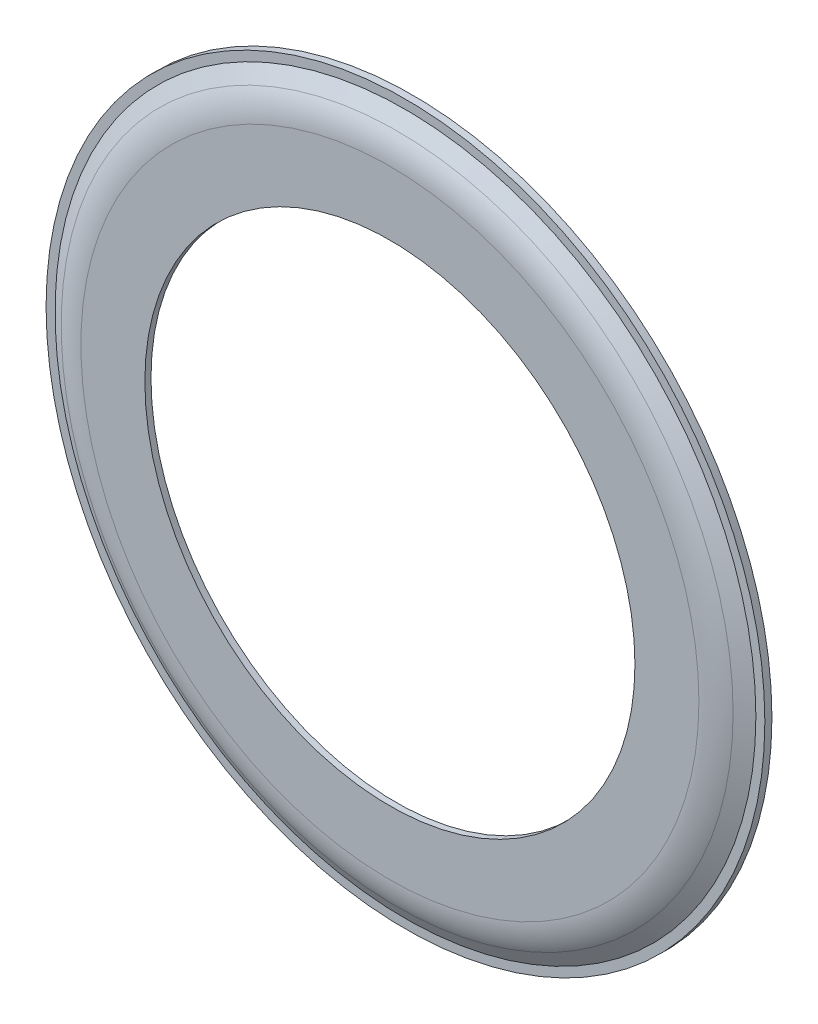
ISO-10303-21;
HEADER;
FILE_DESCRIPTION(('STEP AP214'),'2;1');
FILE_NAME('part.step','',(''),(''),'','','');
FILE_SCHEMA(('AUTOMOTIVE_DESIGN { 1 0 10303 214 1 1 1 1 }'));
ENDSEC;
DATA;
#1=APPLICATION_CONTEXT('core data for automotive mechanical design processes');
#2=APPLICATION_PROTOCOL_DEFINITION('international standard','automotive_design',2000,#1);
#3=PRODUCT_CONTEXT('',#1,'mechanical');
#4=PRODUCT('Part','Part','',(#3));
#5=PRODUCT_RELATED_PRODUCT_CATEGORY('part','',(#4));
#6=PRODUCT_DEFINITION_FORMATION('','',#4);
#7=PRODUCT_DEFINITION_CONTEXT('part definition',#1,'design');
#8=PRODUCT_DEFINITION('design','',#6,#7);
#9=PRODUCT_DEFINITION_SHAPE('','',#8);
#10=(LENGTH_UNIT() NAMED_UNIT(*) SI_UNIT(.MILLI.,.METRE.));
#11=(NAMED_UNIT(*) PLANE_ANGLE_UNIT() SI_UNIT($,.RADIAN.));
#12=(NAMED_UNIT(*) SI_UNIT($,.STERADIAN.) SOLID_ANGLE_UNIT());
#13=UNCERTAINTY_MEASURE_WITH_UNIT(LENGTH_MEASURE(1.E-05),#10,'distance_accuracy_value','');
#14=(GEOMETRIC_REPRESENTATION_CONTEXT(3) GLOBAL_UNCERTAINTY_ASSIGNED_CONTEXT((#13)) GLOBAL_UNIT_ASSIGNED_CONTEXT((#10,
#11,#12)) REPRESENTATION_CONTEXT('',''));
#15=CARTESIAN_POINT('',(0.,0.,0.));
#16=DIRECTION('',(0.,0.,1.));
#17=DIRECTION('',(1.,0.,0.));
#18=AXIS2_PLACEMENT_3D('',#15,#16,#17);
#19=CARTESIAN_POINT('',(0.,2.95,1.975));
#20=DIRECTION('',(0.,0.,-1.));
#21=DIRECTION('',(-1.,0.,0.));
#22=AXIS2_PLACEMENT_3D('',#19,#20,#21);
#23=PLANE('',#22);
#24=CARTESIAN_POINT('',(0.,0.,1.975));
#25=DIRECTION('',(0.,0.,1.));
#26=DIRECTION('',(1.,0.,0.));
#27=AXIS2_PLACEMENT_3D('',#24,#25,#26);
#28=CIRCLE('',#27,3.);
#29=CARTESIAN_POINT('',(3.,0.,1.975));
#30=VERTEX_POINT('',#29);
#31=EDGE_CURVE('E66',#30,#30,#28,.T.);
#32=ORIENTED_EDGE('',*,*,#31,.F.);
#33=EDGE_LOOP('',(#32));
#34=FACE_BOUND('',#33,.T.);
#35=CARTESIAN_POINT('',(0.,0.,1.975));
#36=DIRECTION('',(0.,0.,1.));
#37=DIRECTION('',(1.,0.,0.));
#38=AXIS2_PLACEMENT_3D('',#35,#36,#37);
#39=CIRCLE('',#38,3.78315353299546);
#40=CARTESIAN_POINT('',(3.78315353299546,0.,1.975));
#41=VERTEX_POINT('',#40);
#42=EDGE_CURVE('E10',#41,#41,#39,.T.);
#43=ORIENTED_EDGE('',*,*,#42,.T.);
#44=EDGE_LOOP('',(#43));
#45=FACE_BOUND('',#44,.T.);
#46=ADVANCED_FACE('F38',(#34,#45),#23,.F.);
#47=CARTESIAN_POINT('',(0.,0.,1.315));
#48=DIRECTION('',(0.,0.,1.));
#49=DIRECTION('',(1.,0.,0.));
#50=AXIS2_PLACEMENT_3D('',#47,#48,#49);
#51=TOROIDAL_SURFACE('',#50,3.78315353299546,0.66);
#52=ORIENTED_EDGE('',*,*,#42,.F.);
#53=EDGE_LOOP('',(#52));
#54=FACE_BOUND('',#53,.T.);
#55=CARTESIAN_POINT('',(0.,0.,1.88657676649773));
#56=DIRECTION('',(0.,0.,1.));
#57=DIRECTION('',(1.,0.,0.));
#58=AXIS2_PLACEMENT_3D('',#55,#56,#57);
#59=CIRCLE('',#58,4.11315353299546);
#60=CARTESIAN_POINT('',(4.11315353299546,0.,1.88657676649773));
#61=VERTEX_POINT('',#60);
#62=EDGE_CURVE('E45',#61,#61,#59,.T.);
#63=ORIENTED_EDGE('',*,*,#62,.T.);
#64=EDGE_LOOP('',(#63));
#65=FACE_BOUND('',#64,.T.);
#66=ADVANCED_FACE('F85',(#54,#65),#51,.T.);
#67=CARTESIAN_POINT('',(0.,0.,1.78447441116742));
#68=DIRECTION('',(0.,0.,-1.));
#69=DIRECTION('',(-1.,0.,0.));
#70=AXIS2_PLACEMENT_3D('',#67,#68,#69);
#71=CONICAL_SURFACE('',#70,4.29,1.04719755119659);
#72=ORIENTED_EDGE('',*,*,#62,.F.);
#73=EDGE_LOOP('',(#72));
#74=FACE_BOUND('',#73,.T.);
#75=CARTESIAN_POINT('',(0.,0.,1.78447441116742));
#76=DIRECTION('',(0.,0.,1.));
#77=DIRECTION('',(1.,0.,0.));
#78=AXIS2_PLACEMENT_3D('',#75,#76,#77);
#79=CIRCLE('',#78,4.29);
#80=CARTESIAN_POINT('',(4.29,0.,1.78447441116742));
#81=VERTEX_POINT('',#80);
#82=EDGE_CURVE('E49',#81,#81,#79,.T.);
#83=ORIENTED_EDGE('',*,*,#82,.T.);
#84=EDGE_LOOP('',(#83));
#85=FACE_BOUND('',#84,.T.);
#86=ADVANCED_FACE('F90',(#74,#85),#71,.T.);
#87=CARTESIAN_POINT('',(0.,4.29,1.78447441116742));
#88=DIRECTION('',(0.,0.,-1.));
#89=DIRECTION('',(-1.,0.,0.));
#90=AXIS2_PLACEMENT_3D('',#87,#88,#89);
#91=PLANE('',#90);
#92=ORIENTED_EDGE('',*,*,#82,.F.);
#93=EDGE_LOOP('',(#92));
#94=FACE_BOUND('',#93,.T.);
#95=CARTESIAN_POINT('',(0.,0.,1.78447441116742));
#96=DIRECTION('',(0.,0.,1.));
#97=DIRECTION('',(1.,0.,0.));
#98=AXIS2_PLACEMENT_3D('',#95,#96,#97);
#99=CIRCLE('',#98,4.4);
#100=CARTESIAN_POINT('',(4.4,0.,1.78447441116742));
#101=VERTEX_POINT('',#100);
#102=EDGE_CURVE('E54',#101,#101,#99,.T.);
#103=ORIENTED_EDGE('',*,*,#102,.T.);
#104=EDGE_LOOP('',(#103));
#105=FACE_BOUND('',#104,.T.);
#106=ADVANCED_FACE('F95',(#94,#105),#91,.F.);
#107=CARTESIAN_POINT('',(0.,0.,2.));
#108=DIRECTION('',(0.,0.,1.));
#109=DIRECTION('',(1.,0.,0.));
#110=AXIS2_PLACEMENT_3D('',#107,#108,#109);
#111=CYLINDRICAL_SURFACE('',#110,4.4);
#112=ORIENTED_EDGE('',*,*,#102,.F.);
#113=EDGE_LOOP('',(#112));
#114=FACE_BOUND('',#113,.T.);
#115=CARTESIAN_POINT('',(0.,0.,1.69787187078898));
#116=DIRECTION('',(0.,0.,1.));
#117=DIRECTION('',(1.,0.,0.));
#118=AXIS2_PLACEMENT_3D('',#115,#116,#117);
#119=CIRCLE('',#118,4.4);
#120=CARTESIAN_POINT('',(4.4,0.,1.69787187078898));
#121=VERTEX_POINT('',#120);
#122=EDGE_CURVE('E57',#121,#121,#119,.T.);
#123=ORIENTED_EDGE('',*,*,#122,.T.);
#124=EDGE_LOOP('',(#123));
#125=FACE_BOUND('',#124,.T.);
#126=ADVANCED_FACE('F102',(#114,#125),#111,.T.);
#127=CARTESIAN_POINT('',(0.,4.4,1.69787187078898));
#128=DIRECTION('',(0.,0.,1.));
#129=DIRECTION('',(1.,0.,0.));
#130=AXIS2_PLACEMENT_3D('',#127,#128,#129);
#131=PLANE('',#130);
#132=ORIENTED_EDGE('',*,*,#122,.F.);
#133=EDGE_LOOP('',(#132));
#134=FACE_BOUND('',#133,.T.);
#135=CARTESIAN_POINT('',(0.,0.,1.69787187078898));
#136=DIRECTION('',(0.,0.,1.));
#137=DIRECTION('',(1.,0.,0.));
#138=AXIS2_PLACEMENT_3D('',#135,#136,#137);
#139=CIRCLE('',#138,4.29);
#140=CARTESIAN_POINT('',(4.29,0.,1.69787187078898));
#141=VERTEX_POINT('',#140);
#142=EDGE_CURVE('E60',#141,#141,#139,.T.);
#143=ORIENTED_EDGE('',*,*,#142,.T.);
#144=EDGE_LOOP('',(#143));
#145=FACE_BOUND('',#144,.T.);
#146=ADVANCED_FACE('F106',(#134,#145),#131,.F.);
#147=CARTESIAN_POINT('',(0.,0.,1.9));
#148=DIRECTION('',(0.,0.,-1.));
#149=DIRECTION('',(-1.,0.,0.));
#150=AXIS2_PLACEMENT_3D('',#147,#148,#149);
#151=CONICAL_SURFACE('',#150,3.93990381056767,1.0471975511966);
#152=ORIENTED_EDGE('',*,*,#142,.F.);
#153=EDGE_LOOP('',(#152));
#154=FACE_BOUND('',#153,.T.);
#155=CARTESIAN_POINT('',(0.,0.,1.9));
#156=DIRECTION('',(0.,0.,1.));
#157=DIRECTION('',(1.,0.,0.));
#158=AXIS2_PLACEMENT_3D('',#155,#156,#157);
#159=CIRCLE('',#158,3.93990381056767);
#160=CARTESIAN_POINT('',(3.93990381056767,0.,1.9));
#161=VERTEX_POINT('',#160);
#162=EDGE_CURVE('E63',#161,#161,#159,.T.);
#163=ORIENTED_EDGE('',*,*,#162,.T.);
#164=EDGE_LOOP('',(#163));
#165=FACE_BOUND('',#164,.T.);
#166=ADVANCED_FACE('F82',(#154,#165),#151,.F.);
#167=CARTESIAN_POINT('',(0.,3.93990381056767,1.9));
#168=DIRECTION('',(0.,0.,1.));
#169=DIRECTION('',(1.,0.,0.));
#170=AXIS2_PLACEMENT_3D('',#167,#168,#169);
#171=PLANE('',#170);
#172=CARTESIAN_POINT('',(0.,0.,1.9));
#173=DIRECTION('',(0.,0.,1.));
#174=DIRECTION('',(1.,0.,0.));
#175=AXIS2_PLACEMENT_3D('',#172,#173,#174);
#176=CIRCLE('',#175,3.);
#177=CARTESIAN_POINT('',(3.,0.,1.9));
#178=VERTEX_POINT('',#177);
#179=EDGE_CURVE('E41',#178,#178,#176,.T.);
#180=ORIENTED_EDGE('',*,*,#179,.T.);
#181=EDGE_LOOP('',(#180));
#182=FACE_BOUND('',#181,.T.);
#183=ORIENTED_EDGE('',*,*,#162,.F.);
#184=EDGE_LOOP('',(#183));
#185=FACE_BOUND('',#184,.T.);
#186=ADVANCED_FACE('F73',(#182,#185),#171,.F.);
#187=CARTESIAN_POINT('',(0.,0.,-2.));
#188=DIRECTION('',(0.,0.,1.));
#189=DIRECTION('',(1.,0.,0.));
#190=AXIS2_PLACEMENT_3D('',#187,#188,#189);
#191=CYLINDRICAL_SURFACE('',#190,3.);
#192=ORIENTED_EDGE('',*,*,#31,.T.);
#193=EDGE_LOOP('',(#192));
#194=FACE_BOUND('',#193,.T.);
#195=ORIENTED_EDGE('',*,*,#179,.F.);
#196=EDGE_LOOP('',(#195));
#197=FACE_BOUND('',#196,.T.);
#198=ADVANCED_FACE('F76',(#194,#197),#191,.F.);
#199=CLOSED_SHELL('',(#46,#66,#86,#106,#126,#146,#166,#186,#198));
#200=MANIFOLD_SOLID_BREP('B2',#199);
#201=ADVANCED_BREP_SHAPE_REPRESENTATION('',(#18,#200),#14);
#202=SHAPE_DEFINITION_REPRESENTATION(#9,#201);
ENDSEC;
END-ISO-10303-21;
